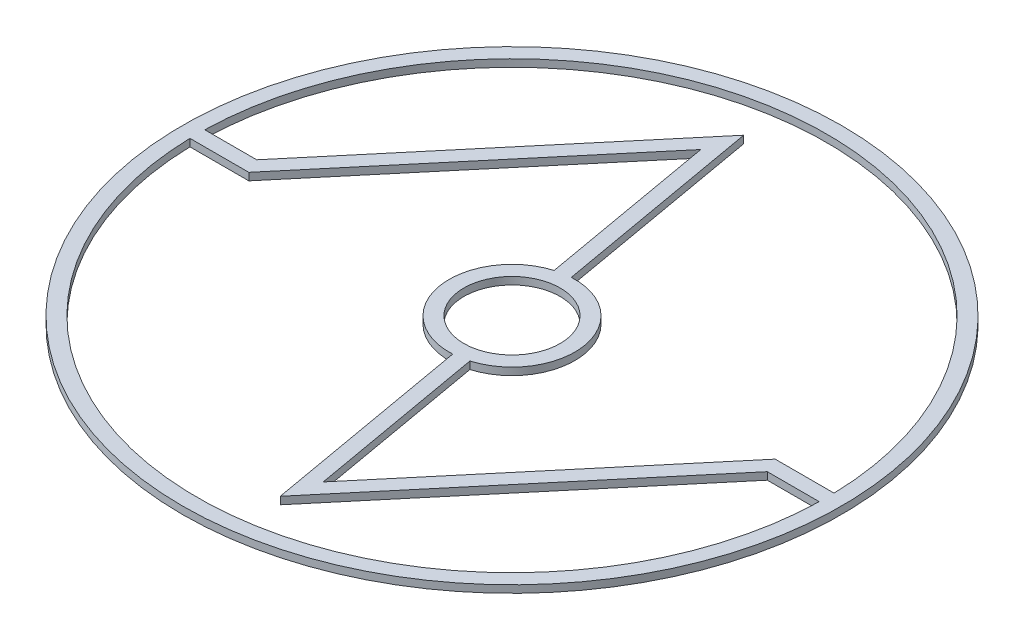
ISO-10303-21;
HEADER;
FILE_DESCRIPTION(('STEP AP214'),'2;1');
FILE_NAME('part.step','',(''),(''),'','','');
FILE_SCHEMA(('AUTOMOTIVE_DESIGN { 1 0 10303 214 1 1 1 1 }'));
ENDSEC;
DATA;
#1=APPLICATION_CONTEXT('core data for automotive mechanical design processes');
#2=APPLICATION_PROTOCOL_DEFINITION('international standard','automotive_design',2000,#1);
#3=PRODUCT_CONTEXT('',#1,'mechanical');
#4=PRODUCT('Part','Part','',(#3));
#5=PRODUCT_RELATED_PRODUCT_CATEGORY('part','',(#4));
#6=PRODUCT_DEFINITION_FORMATION('','',#4);
#7=PRODUCT_DEFINITION_CONTEXT('part definition',#1,'design');
#8=PRODUCT_DEFINITION('design','',#6,#7);
#9=PRODUCT_DEFINITION_SHAPE('','',#8);
#10=(LENGTH_UNIT() NAMED_UNIT(*) SI_UNIT(.MILLI.,.METRE.));
#11=(NAMED_UNIT(*) PLANE_ANGLE_UNIT() SI_UNIT($,.RADIAN.));
#12=(NAMED_UNIT(*) SI_UNIT($,.STERADIAN.) SOLID_ANGLE_UNIT());
#13=UNCERTAINTY_MEASURE_WITH_UNIT(LENGTH_MEASURE(1.E-05),#10,'distance_accuracy_value','');
#14=(GEOMETRIC_REPRESENTATION_CONTEXT(3) GLOBAL_UNCERTAINTY_ASSIGNED_CONTEXT((#13)) GLOBAL_UNIT_ASSIGNED_CONTEXT((#10,
#11,#12)) REPRESENTATION_CONTEXT('',''));
#15=CARTESIAN_POINT('',(0.,0.,0.));
#16=DIRECTION('',(0.,0.,1.));
#17=DIRECTION('',(1.,0.,0.));
#18=AXIS2_PLACEMENT_3D('',#15,#16,#17);
#19=CARTESIAN_POINT('',(0.,1.,0.));
#20=DIRECTION('',(0.,-1.,0.));
#21=DIRECTION('',(0.,0.,-1.));
#22=AXIS2_PLACEMENT_3D('',#19,#20,#21);
#23=CYLINDRICAL_SURFACE('',#22,8.5);
#24=CARTESIAN_POINT('',(0.,0.,0.));
#25=DIRECTION('',(0.,1.,0.));
#26=DIRECTION('',(0.,0.,1.));
#27=AXIS2_PLACEMENT_3D('',#24,#25,#26);
#28=CIRCLE('',#27,8.5);
#29=CARTESIAN_POINT('',(2.45056707312651,0.,8.13908600643268));
#30=VERTEX_POINT('',#29);
#31=CARTESIAN_POINT('',(-0.480951567102091,0.,-8.48638236176653));
#32=VERTEX_POINT('',#31);
#33=EDGE_CURVE('E218',#30,#32,#28,.T.);
#34=ORIENTED_EDGE('',*,*,#33,.T.);
#35=DIRECTION('',(0.,-1.,0.));
#36=VECTOR('',#35,1.);
#37=CARTESIAN_POINT('',(-0.480951567102091,1.,-8.48638236176653));
#38=LINE('',#37,#36);
#39=CARTESIAN_POINT('',(-0.480951567102091,1.,-8.48638236176653));
#40=VERTEX_POINT('',#39);
#41=EDGE_CURVE('E11',#40,#32,#38,.T.);
#42=ORIENTED_EDGE('',*,*,#41,.F.);
#43=CARTESIAN_POINT('',(0.,1.,0.));
#44=DIRECTION('',(0.,1.,0.));
#45=DIRECTION('',(0.,0.,1.));
#46=AXIS2_PLACEMENT_3D('',#43,#44,#45);
#47=CIRCLE('',#46,8.5);
#48=CARTESIAN_POINT('',(2.45056707312651,1.,8.13908600643268));
#49=VERTEX_POINT('',#48);
#50=EDGE_CURVE('E491',#49,#40,#47,.T.);
#51=ORIENTED_EDGE('',*,*,#50,.F.);
#52=DIRECTION('',(0.,-1.,0.));
#53=VECTOR('',#52,1.);
#54=CARTESIAN_POINT('',(2.45056707312651,1.,8.13908600643268));
#55=LINE('',#54,#53);
#56=EDGE_CURVE('E57',#49,#30,#55,.T.);
#57=ORIENTED_EDGE('',*,*,#56,.T.);
#58=EDGE_LOOP('',(#34,#42,#51,#57));
#59=FACE_BOUND('',#58,.T.);
#60=ADVANCED_FACE('F38',(#59),#23,.T.);
#61=CARTESIAN_POINT('',(0.984807753012209,1.,-0.173648177666927));
#62=DIRECTION('',(0.984807753012209,0.,-0.173648177666927));
#63=DIRECTION('',(-0.173648177666927,0.,-0.984807753012209));
#64=AXIS2_PLACEMENT_3D('',#61,#62,#63);
#65=PLANE('',#64);
#66=DIRECTION('',(0.173648177666927,0.,0.984807753012209));
#67=VECTOR('',#66,1.);
#68=CARTESIAN_POINT('',(0.984807753012209,0.,-0.173648177666927));
#69=LINE('',#68,#67);
#70=CARTESIAN_POINT('',(-5.46592563419329,0.,-36.7575751597272));
#71=VERTEX_POINT('',#70);
#72=EDGE_CURVE('E220',#71,#32,#69,.T.);
#73=ORIENTED_EDGE('',*,*,#72,.F.);
#74=DIRECTION('',(0.,-1.,0.));
#75=VECTOR('',#74,1.);
#76=CARTESIAN_POINT('',(-5.46592563419329,1.,-36.7575751597272));
#77=LINE('',#76,#75);
#78=CARTESIAN_POINT('',(-5.46592563419329,1.,-36.7575751597272));
#79=VERTEX_POINT('',#78);
#80=EDGE_CURVE('E48',#79,#71,#77,.T.);
#81=ORIENTED_EDGE('',*,*,#80,.F.);
#82=DIRECTION('',(0.173648177666927,0.,0.984807753012209));
#83=VECTOR('',#82,1.);
#84=CARTESIAN_POINT('',(0.984807753012209,1.,-0.173648177666927));
#85=LINE('',#84,#83);
#86=EDGE_CURVE('E493',#79,#40,#85,.T.);
#87=ORIENTED_EDGE('',*,*,#86,.T.);
#88=ORIENTED_EDGE('',*,*,#41,.T.);
#89=EDGE_LOOP('',(#73,#81,#87,#88));
#90=FACE_BOUND('',#89,.T.);
#91=ADVANCED_FACE('F312',(#90),#65,.T.);
#92=CARTESIAN_POINT('',(-21.3071093295311,1.,-17.8787875798634));
#93=DIRECTION('',(-0.766044443118979,0.,-0.642787609686538));
#94=DIRECTION('',(-0.642787609686538,0.,0.766044443118979));
#95=AXIS2_PLACEMENT_3D('',#92,#93,#94);
#96=PLANE('',#95);
#97=DIRECTION('',(0.642787609686538,0.,-0.766044443118979));
#98=VECTOR('',#97,1.);
#99=CARTESIAN_POINT('',(-21.3071093295311,0.,-17.8787875798634));
#100=LINE('',#99,#98);
#101=CARTESIAN_POINT('',(-35.4700937625141,0.,-1.));
#102=VERTEX_POINT('',#101);
#103=EDGE_CURVE('E223',#102,#71,#100,.T.);
#104=ORIENTED_EDGE('',*,*,#103,.F.);
#105=DIRECTION('',(0.,-1.,0.));
#106=VECTOR('',#105,1.);
#107=CARTESIAN_POINT('',(-35.4700937625141,1.,-1.));
#108=LINE('',#107,#106);
#109=CARTESIAN_POINT('',(-35.4700937625141,1.,-1.));
#110=VERTEX_POINT('',#109);
#111=EDGE_CURVE('E244',#110,#102,#108,.T.);
#112=ORIENTED_EDGE('',*,*,#111,.F.);
#113=DIRECTION('',(0.642787609686538,0.,-0.766044443118979));
#114=VECTOR('',#113,1.);
#115=CARTESIAN_POINT('',(-21.3071093295311,1.,-17.8787875798634));
#116=LINE('',#115,#114);
#117=EDGE_CURVE('E496',#110,#79,#116,.T.);
#118=ORIENTED_EDGE('',*,*,#117,.T.);
#119=ORIENTED_EDGE('',*,*,#80,.T.);
#120=EDGE_LOOP('',(#104,#112,#118,#119));
#121=FACE_BOUND('',#120,.T.);
#122=ADVANCED_FACE('F317',(#121),#96,.T.);
#123=CARTESIAN_POINT('',(0.,1.,-1.));
#124=DIRECTION('',(0.,0.,-1.));
#125=DIRECTION('',(-1.,0.,0.));
#126=AXIS2_PLACEMENT_3D('',#123,#124,#125);
#127=PLANE('',#126);
#128=DIRECTION('',(1.,0.,0.));
#129=VECTOR('',#128,1.);
#130=CARTESIAN_POINT('',(0.,0.,-1.));
#131=LINE('',#130,#129);
#132=CARTESIAN_POINT('',(-42.4882336653337,0.,-1.));
#133=VERTEX_POINT('',#132);
#134=EDGE_CURVE('E226',#133,#102,#131,.T.);
#135=ORIENTED_EDGE('',*,*,#134,.F.);
#136=DIRECTION('',(0.,-1.,0.));
#137=VECTOR('',#136,1.);
#138=CARTESIAN_POINT('',(-42.4882336653337,1.,-1.));
#139=LINE('',#138,#137);
#140=CARTESIAN_POINT('',(-42.4882336653337,1.,-1.));
#141=VERTEX_POINT('',#140);
#142=EDGE_CURVE('E242',#141,#133,#139,.T.);
#143=ORIENTED_EDGE('',*,*,#142,.F.);
#144=DIRECTION('',(1.,0.,0.));
#145=VECTOR('',#144,1.);
#146=CARTESIAN_POINT('',(0.,1.,-1.));
#147=LINE('',#146,#145);
#148=EDGE_CURVE('E498',#141,#110,#147,.T.);
#149=ORIENTED_EDGE('',*,*,#148,.T.);
#150=ORIENTED_EDGE('',*,*,#111,.T.);
#151=EDGE_LOOP('',(#135,#143,#149,#150));
#152=FACE_BOUND('',#151,.T.);
#153=ADVANCED_FACE('F338',(#152),#127,.T.);
#154=CARTESIAN_POINT('',(0.,1.,0.));
#155=DIRECTION('',(0.,-1.,0.));
#156=DIRECTION('',(0.,0.,-1.));
#157=AXIS2_PLACEMENT_3D('',#154,#155,#156);
#158=CYLINDRICAL_SURFACE('',#157,42.5);
#159=CARTESIAN_POINT('',(0.,0.,0.));
#160=DIRECTION('',(0.,1.,0.));
#161=DIRECTION('',(0.,0.,1.));
#162=AXIS2_PLACEMENT_3D('',#159,#160,#161);
#163=CIRCLE('',#162,42.5);
#164=CARTESIAN_POINT('',(42.4882336653337,0.,-1.));
#165=VERTEX_POINT('',#164);
#166=EDGE_CURVE('E212',#165,#133,#163,.T.);
#167=ORIENTED_EDGE('',*,*,#166,.F.);
#168=DIRECTION('',(0.,-1.,0.));
#169=VECTOR('',#168,1.);
#170=CARTESIAN_POINT('',(42.4882336653337,1.,-1.));
#171=LINE('',#170,#169);
#172=CARTESIAN_POINT('',(42.4882336653337,1.,-1.));
#173=VERTEX_POINT('',#172);
#174=EDGE_CURVE('E167',#173,#165,#171,.T.);
#175=ORIENTED_EDGE('',*,*,#174,.F.);
#176=CARTESIAN_POINT('',(0.,1.,0.));
#177=DIRECTION('',(0.,1.,0.));
#178=DIRECTION('',(0.,0.,1.));
#179=AXIS2_PLACEMENT_3D('',#176,#177,#178);
#180=CIRCLE('',#179,42.5);
#181=EDGE_CURVE('E178',#173,#141,#180,.T.);
#182=ORIENTED_EDGE('',*,*,#181,.T.);
#183=ORIENTED_EDGE('',*,*,#142,.T.);
#184=EDGE_LOOP('',(#167,#175,#182,#183));
#185=FACE_BOUND('',#184,.T.);
#186=ADVANCED_FACE('F332',(#185),#158,.F.);
#187=CARTESIAN_POINT('',(0.,1.,-1.));
#188=DIRECTION('',(0.,0.,-1.));
#189=DIRECTION('',(-1.,0.,0.));
#190=AXIS2_PLACEMENT_3D('',#187,#188,#189);
#191=PLANE('',#190);
#192=DIRECTION('',(1.,0.,0.));
#193=VECTOR('',#192,1.);
#194=CARTESIAN_POINT('',(0.,0.,-1.));
#195=LINE('',#194,#193);
#196=CARTESIAN_POINT('',(34.5374784462041,0.,-1.));
#197=VERTEX_POINT('',#196);
#198=EDGE_CURVE('E163',#197,#165,#195,.T.);
#199=ORIENTED_EDGE('',*,*,#198,.F.);
#200=DIRECTION('',(0.,-1.,0.));
#201=VECTOR('',#200,1.);
#202=CARTESIAN_POINT('',(34.5374784462041,1.,-1.));
#203=LINE('',#202,#201);
#204=CARTESIAN_POINT('',(34.5374784462041,1.,-1.));
#205=VERTEX_POINT('',#204);
#206=EDGE_CURVE('E158',#205,#197,#203,.T.);
#207=ORIENTED_EDGE('',*,*,#206,.F.);
#208=DIRECTION('',(1.,0.,0.));
#209=VECTOR('',#208,1.);
#210=CARTESIAN_POINT('',(0.,1.,-1.));
#211=LINE('',#210,#209);
#212=EDGE_CURVE('E161',#205,#173,#211,.T.);
#213=ORIENTED_EDGE('',*,*,#212,.T.);
#214=ORIENTED_EDGE('',*,*,#174,.T.);
#215=EDGE_LOOP('',(#199,#207,#213,#214));
#216=FACE_BOUND('',#215,.T.);
#217=ADVANCED_FACE('F160',(#216),#191,.T.);
#218=CARTESIAN_POINT('',(19.7750204432931,1.,16.5932123604904));
#219=DIRECTION('',(-0.766044443118979,0.,-0.642787609686538));
#220=DIRECTION('',(-0.642787609686538,0.,0.766044443118979));
#221=AXIS2_PLACEMENT_3D('',#218,#219,#220);
#222=PLANE('',#221);
#223=DIRECTION('',(0.642787609686538,0.,-0.766044443118979));
#224=VECTOR('',#223,1.);
#225=CARTESIAN_POINT('',(19.7750204432931,0.,16.5932123604904));
#226=LINE('',#225,#224);
#227=CARTESIAN_POINT('',(6.69076170273651,0.,32.186424720981));
#228=VERTEX_POINT('',#227);
#229=EDGE_CURVE('E230',#228,#197,#226,.T.);
#230=ORIENTED_EDGE('',*,*,#229,.F.);
#231=DIRECTION('',(0.,-1.,0.));
#232=VECTOR('',#231,1.);
#233=CARTESIAN_POINT('',(6.69076170273651,1.,32.186424720981));
#234=LINE('',#233,#232);
#235=CARTESIAN_POINT('',(6.69076170273651,1.,32.186424720981));
#236=VERTEX_POINT('',#235);
#237=EDGE_CURVE('E106',#236,#228,#234,.T.);
#238=ORIENTED_EDGE('',*,*,#237,.F.);
#239=DIRECTION('',(0.642787609686538,0.,-0.766044443118979));
#240=VECTOR('',#239,1.);
#241=CARTESIAN_POINT('',(19.7750204432931,1.,16.5932123604904));
#242=LINE('',#241,#240);
#243=EDGE_CURVE('E175',#236,#205,#242,.T.);
#244=ORIENTED_EDGE('',*,*,#243,.T.);
#245=ORIENTED_EDGE('',*,*,#206,.T.);
#246=EDGE_LOOP('',(#230,#238,#244,#245));
#247=FACE_BOUND('',#246,.T.);
#248=ADVANCED_FACE('F180',(#247),#222,.T.);
#249=CARTESIAN_POINT('',(-0.984807753012208,1.,0.173648177666927));
#250=DIRECTION('',(-0.984807753012209,0.,0.173648177666927));
#251=DIRECTION('',(0.173648177666927,0.,0.984807753012209));
#252=AXIS2_PLACEMENT_3D('',#249,#250,#251);
#253=PLANE('',#252);
#254=DIRECTION('',(-0.173648177666927,0.,-0.984807753012209));
#255=VECTOR('',#254,1.);
#256=CARTESIAN_POINT('',(-0.984807753012208,0.,0.173648177666927));
#257=LINE('',#256,#255);
#258=CARTESIAN_POINT('',(-2.45056707312651,0.,-8.13908600643268));
#259=VERTEX_POINT('',#258);
#260=CARTESIAN_POINT('',(-6.69076170273651,0.,-32.186424720981));
#261=VERTEX_POINT('',#260);
#262=EDGE_CURVE('E193',#259,#261,#257,.T.);
#263=ORIENTED_EDGE('',*,*,#262,.F.);
#264=DIRECTION('',(0.,-1.,0.));
#265=VECTOR('',#264,1.);
#266=CARTESIAN_POINT('',(-2.45056707312651,1.,-8.13908600643268));
#267=LINE('',#266,#265);
#268=CARTESIAN_POINT('',(-2.45056707312651,1.,-8.13908600643268));
#269=VERTEX_POINT('',#268);
#270=EDGE_CURVE('E42',#269,#259,#267,.T.);
#271=ORIENTED_EDGE('',*,*,#270,.F.);
#272=DIRECTION('',(-0.173648177666927,0.,-0.984807753012209));
#273=VECTOR('',#272,1.);
#274=CARTESIAN_POINT('',(-0.984807753012208,1.,0.173648177666927));
#275=LINE('',#274,#273);
#276=CARTESIAN_POINT('',(-6.69076170273651,1.,-32.186424720981));
#277=VERTEX_POINT('',#276);
#278=EDGE_CURVE('E272',#269,#277,#275,.T.);
#279=ORIENTED_EDGE('',*,*,#278,.T.);
#280=DIRECTION('',(0.,-1.,0.));
#281=VECTOR('',#280,1.);
#282=CARTESIAN_POINT('',(-6.69076170273651,1.,-32.186424720981));
#283=LINE('',#282,#281);
#284=EDGE_CURVE('E189',#277,#261,#283,.T.);
#285=ORIENTED_EDGE('',*,*,#284,.T.);
#286=EDGE_LOOP('',(#263,#271,#279,#285));
#287=FACE_BOUND('',#286,.T.);
#288=ADVANCED_FACE('F271',(#287),#253,.T.);
#289=CARTESIAN_POINT('',(0.,1.,0.));
#290=DIRECTION('',(0.,-1.,0.));
#291=DIRECTION('',(0.,0.,-1.));
#292=AXIS2_PLACEMENT_3D('',#289,#290,#291);
#293=CYLINDRICAL_SURFACE('',#292,8.5);
#294=CARTESIAN_POINT('',(0.,0.,0.));
#295=DIRECTION('',(0.,1.,0.));
#296=DIRECTION('',(0.,0.,1.));
#297=AXIS2_PLACEMENT_3D('',#294,#295,#296);
#298=CIRCLE('',#297,8.5);
#299=CARTESIAN_POINT('',(0.480951567102092,0.,8.48638236176653));
#300=VERTEX_POINT('',#299);
#301=EDGE_CURVE('E196',#259,#300,#298,.T.);
#302=ORIENTED_EDGE('',*,*,#301,.T.);
#303=DIRECTION('',(0.,-1.,0.));
#304=VECTOR('',#303,1.);
#305=CARTESIAN_POINT('',(0.480951567102092,1.,8.48638236176653));
#306=LINE('',#305,#304);
#307=CARTESIAN_POINT('',(0.480951567102092,1.,8.48638236176653));
#308=VERTEX_POINT('',#307);
#309=EDGE_CURVE('E257',#308,#300,#306,.T.);
#310=ORIENTED_EDGE('',*,*,#309,.F.);
#311=CARTESIAN_POINT('',(0.,1.,0.));
#312=DIRECTION('',(0.,1.,0.));
#313=DIRECTION('',(0.,0.,1.));
#314=AXIS2_PLACEMENT_3D('',#311,#312,#313);
#315=CIRCLE('',#314,8.5);
#316=EDGE_CURVE('E265',#269,#308,#315,.T.);
#317=ORIENTED_EDGE('',*,*,#316,.F.);
#318=ORIENTED_EDGE('',*,*,#270,.T.);
#319=EDGE_LOOP('',(#302,#310,#317,#318));
#320=FACE_BOUND('',#319,.T.);
#321=ADVANCED_FACE('F264',(#320),#293,.T.);
#322=CARTESIAN_POINT('',(-0.984807753012208,1.,0.173648177666927));
#323=DIRECTION('',(-0.984807753012209,0.,0.173648177666927));
#324=DIRECTION('',(0.173648177666927,0.,0.984807753012209));
#325=AXIS2_PLACEMENT_3D('',#322,#323,#324);
#326=PLANE('',#325);
#327=DIRECTION('',(-0.173648177666927,0.,-0.984807753012209));
#328=VECTOR('',#327,1.);
#329=CARTESIAN_POINT('',(-0.984807753012208,0.,0.173648177666927));
#330=LINE('',#329,#328);
#331=CARTESIAN_POINT('',(5.46592563419329,0.,36.7575751597272));
#332=VERTEX_POINT('',#331);
#333=EDGE_CURVE('E199',#332,#300,#330,.T.);
#334=ORIENTED_EDGE('',*,*,#333,.F.);
#335=DIRECTION('',(0.,-1.,0.));
#336=VECTOR('',#335,1.);
#337=CARTESIAN_POINT('',(5.46592563419329,1.,36.7575751597272));
#338=LINE('',#337,#336);
#339=CARTESIAN_POINT('',(5.46592563419329,1.,36.7575751597272));
#340=VERTEX_POINT('',#339);
#341=EDGE_CURVE('E256',#340,#332,#338,.T.);
#342=ORIENTED_EDGE('',*,*,#341,.F.);
#343=DIRECTION('',(-0.173648177666927,0.,-0.984807753012209));
#344=VECTOR('',#343,1.);
#345=CARTESIAN_POINT('',(-0.984807753012208,1.,0.173648177666927));
#346=LINE('',#345,#344);
#347=EDGE_CURVE('E480',#340,#308,#346,.T.);
#348=ORIENTED_EDGE('',*,*,#347,.T.);
#349=ORIENTED_EDGE('',*,*,#309,.T.);
#350=EDGE_LOOP('',(#334,#342,#348,#349));
#351=FACE_BOUND('',#350,.T.);
#352=ADVANCED_FACE('F302',(#351),#326,.T.);
#353=CARTESIAN_POINT('',(21.3071093295311,1.,17.8787875798634));
#354=DIRECTION('',(0.766044443118979,0.,0.642787609686538));
#355=DIRECTION('',(0.642787609686538,0.,-0.766044443118979));
#356=AXIS2_PLACEMENT_3D('',#353,#354,#355);
#357=PLANE('',#356);
#358=DIRECTION('',(-0.642787609686538,0.,0.766044443118979));
#359=VECTOR('',#358,1.);
#360=CARTESIAN_POINT('',(21.3071093295311,0.,17.8787875798634));
#361=LINE('',#360,#359);
#362=CARTESIAN_POINT('',(35.4700937625141,0.,1.));
#363=VERTEX_POINT('',#362);
#364=EDGE_CURVE('E202',#363,#332,#361,.T.);
#365=ORIENTED_EDGE('',*,*,#364,.F.);
#366=DIRECTION('',(0.,-1.,0.));
#367=VECTOR('',#366,1.);
#368=CARTESIAN_POINT('',(35.4700937625141,1.,1.));
#369=LINE('',#368,#367);
#370=CARTESIAN_POINT('',(35.4700937625141,1.,1.));
#371=VERTEX_POINT('',#370);
#372=EDGE_CURVE('E254',#371,#363,#369,.T.);
#373=ORIENTED_EDGE('',*,*,#372,.F.);
#374=DIRECTION('',(-0.642787609686538,0.,0.766044443118979));
#375=VECTOR('',#374,1.);
#376=CARTESIAN_POINT('',(21.3071093295311,1.,17.8787875798634));
#377=LINE('',#376,#375);
#378=EDGE_CURVE('E300',#371,#340,#377,.T.);
#379=ORIENTED_EDGE('',*,*,#378,.T.);
#380=ORIENTED_EDGE('',*,*,#341,.T.);
#381=EDGE_LOOP('',(#365,#373,#379,#380));
#382=FACE_BOUND('',#381,.T.);
#383=ADVANCED_FACE('F297',(#382),#357,.T.);
#384=CARTESIAN_POINT('',(0.,1.,1.00000000000001));
#385=DIRECTION('',(0.,0.,1.));
#386=DIRECTION('',(1.,0.,0.));
#387=AXIS2_PLACEMENT_3D('',#384,#385,#386);
#388=PLANE('',#387);
#389=DIRECTION('',(-1.,0.,0.));
#390=VECTOR('',#389,1.);
#391=CARTESIAN_POINT('',(0.,0.,1.00000000000001));
#392=LINE('',#391,#390);
#393=CARTESIAN_POINT('',(42.4882336653337,0.,1.));
#394=VERTEX_POINT('',#393);
#395=EDGE_CURVE('E205',#394,#363,#392,.T.);
#396=ORIENTED_EDGE('',*,*,#395,.F.);
#397=DIRECTION('',(0.,-1.,0.));
#398=VECTOR('',#397,1.);
#399=CARTESIAN_POINT('',(42.4882336653337,1.,1.));
#400=LINE('',#399,#398);
#401=CARTESIAN_POINT('',(42.4882336653337,1.,1.));
#402=VERTEX_POINT('',#401);
#403=EDGE_CURVE('E252',#402,#394,#400,.T.);
#404=ORIENTED_EDGE('',*,*,#403,.F.);
#405=DIRECTION('',(-1.,0.,0.));
#406=VECTOR('',#405,1.);
#407=CARTESIAN_POINT('',(0.,1.,1.00000000000001));
#408=LINE('',#407,#406);
#409=EDGE_CURVE('E486',#402,#371,#408,.T.);
#410=ORIENTED_EDGE('',*,*,#409,.T.);
#411=ORIENTED_EDGE('',*,*,#372,.T.);
#412=EDGE_LOOP('',(#396,#404,#410,#411));
#413=FACE_BOUND('',#412,.T.);
#414=ADVANCED_FACE('F294',(#413),#388,.T.);
#415=CARTESIAN_POINT('',(-42.4882336653337,0.,1.));
#416=VERTEX_POINT('',#415);
#417=EDGE_CURVE('E208',#416,#394,#163,.T.);
#418=ORIENTED_EDGE('',*,*,#417,.F.);
#419=DIRECTION('',(0.,-1.,0.));
#420=VECTOR('',#419,1.);
#421=CARTESIAN_POINT('',(-42.4882336653337,1.,1.));
#422=LINE('',#421,#420);
#423=CARTESIAN_POINT('',(-42.4882336653337,1.,1.));
#424=VERTEX_POINT('',#423);
#425=EDGE_CURVE('E250',#424,#416,#422,.T.);
#426=ORIENTED_EDGE('',*,*,#425,.F.);
#427=EDGE_CURVE('E290',#424,#402,#180,.T.);
#428=ORIENTED_EDGE('',*,*,#427,.T.);
#429=ORIENTED_EDGE('',*,*,#403,.T.);
#430=EDGE_LOOP('',(#418,#426,#428,#429));
#431=FACE_BOUND('',#430,.T.);
#432=ADVANCED_FACE('F288',(#431),#158,.F.);
#433=CARTESIAN_POINT('',(0.,1.,0.999999999999992));
#434=DIRECTION('',(0.,0.,1.));
#435=DIRECTION('',(1.,0.,0.));
#436=AXIS2_PLACEMENT_3D('',#433,#434,#435);
#437=PLANE('',#436);
#438=DIRECTION('',(-1.,0.,0.));
#439=VECTOR('',#438,1.);
#440=CARTESIAN_POINT('',(0.,0.,0.999999999999992));
#441=LINE('',#440,#439);
#442=CARTESIAN_POINT('',(-34.5374784462041,0.,0.999999999999997));
#443=VERTEX_POINT('',#442);
#444=EDGE_CURVE('E211',#443,#416,#441,.T.);
#445=ORIENTED_EDGE('',*,*,#444,.F.);
#446=DIRECTION('',(0.,-1.,0.));
#447=VECTOR('',#446,1.);
#448=CARTESIAN_POINT('',(-34.5374784462041,1.,0.999999999999997));
#449=LINE('',#448,#447);
#450=CARTESIAN_POINT('',(-34.5374784462041,1.,0.999999999999997));
#451=VERTEX_POINT('',#450);
#452=EDGE_CURVE('E248',#451,#443,#449,.T.);
#453=ORIENTED_EDGE('',*,*,#452,.F.);
#454=DIRECTION('',(-1.,0.,0.));
#455=VECTOR('',#454,1.);
#456=CARTESIAN_POINT('',(0.,1.,0.999999999999992));
#457=LINE('',#456,#455);
#458=EDGE_CURVE('E284',#451,#424,#457,.T.);
#459=ORIENTED_EDGE('',*,*,#458,.T.);
#460=ORIENTED_EDGE('',*,*,#425,.T.);
#461=EDGE_LOOP('',(#445,#453,#459,#460));
#462=FACE_BOUND('',#461,.T.);
#463=ADVANCED_FACE('F281',(#462),#437,.T.);
#464=CARTESIAN_POINT('',(0.984807753012209,1.,-0.173648177666927));
#465=DIRECTION('',(0.984807753012209,0.,-0.173648177666927));
#466=DIRECTION('',(-0.173648177666927,0.,-0.984807753012209));
#467=AXIS2_PLACEMENT_3D('',#464,#465,#466);
#468=PLANE('',#467);
#469=DIRECTION('',(0.173648177666927,0.,0.984807753012209));
#470=VECTOR('',#469,1.);
#471=CARTESIAN_POINT('',(0.984807753012209,0.,-0.173648177666927));
#472=LINE('',#471,#470);
#473=EDGE_CURVE('E232',#30,#228,#472,.T.);
#474=ORIENTED_EDGE('',*,*,#473,.F.);
#475=ORIENTED_EDGE('',*,*,#56,.F.);
#476=DIRECTION('',(0.173648177666927,0.,0.984807753012209));
#477=VECTOR('',#476,1.);
#478=CARTESIAN_POINT('',(0.984807753012209,1.,-0.173648177666927));
#479=LINE('',#478,#477);
#480=EDGE_CURVE('E181',#49,#236,#479,.T.);
#481=ORIENTED_EDGE('',*,*,#480,.T.);
#482=ORIENTED_EDGE('',*,*,#237,.T.);
#483=EDGE_LOOP('',(#474,#475,#481,#482));
#484=FACE_BOUND('',#483,.T.);
#485=ADVANCED_FACE('F324',(#484),#468,.T.);
#486=CARTESIAN_POINT('',(-19.7750204432931,1.,-16.5932123604904));
#487=DIRECTION('',(0.766044443118979,0.,0.642787609686538));
#488=DIRECTION('',(0.642787609686538,0.,-0.766044443118979));
#489=AXIS2_PLACEMENT_3D('',#486,#487,#488);
#490=PLANE('',#489);
#491=DIRECTION('',(-0.642787609686538,0.,0.766044443118979));
#492=VECTOR('',#491,1.);
#493=CARTESIAN_POINT('',(-19.7750204432931,0.,-16.5932123604904));
#494=LINE('',#493,#492);
#495=EDGE_CURVE('E215',#261,#443,#494,.T.);
#496=ORIENTED_EDGE('',*,*,#495,.F.);
#497=ORIENTED_EDGE('',*,*,#284,.F.);
#498=DIRECTION('',(-0.642787609686538,0.,0.766044443118979));
#499=VECTOR('',#498,1.);
#500=CARTESIAN_POINT('',(-19.7750204432931,1.,-16.5932123604904));
#501=LINE('',#500,#499);
#502=EDGE_CURVE('E277',#277,#451,#501,.T.);
#503=ORIENTED_EDGE('',*,*,#502,.T.);
#504=ORIENTED_EDGE('',*,*,#452,.T.);
#505=EDGE_LOOP('',(#496,#497,#503,#504));
#506=FACE_BOUND('',#505,.T.);
#507=ADVANCED_FACE('F276',(#506),#490,.T.);
#508=CARTESIAN_POINT('',(0.,1.,0.));
#509=DIRECTION('',(0.,-1.,0.));
#510=DIRECTION('',(0.,0.,-1.));
#511=AXIS2_PLACEMENT_3D('',#508,#509,#510);
#512=CYLINDRICAL_SURFACE('',#511,6.5);
#513=CARTESIAN_POINT('',(0.,1.,0.));
#514=DIRECTION('',(0.,1.,0.));
#515=DIRECTION('',(0.,0.,1.));
#516=AXIS2_PLACEMENT_3D('',#513,#514,#515);
#517=CIRCLE('',#516,6.5);
#518=CARTESIAN_POINT('',(0.,1.,6.5));
#519=VERTEX_POINT('',#518);
#520=EDGE_CURVE('E238',#519,#519,#517,.T.);
#521=ORIENTED_EDGE('',*,*,#520,.T.);
#522=EDGE_LOOP('',(#521));
#523=FACE_BOUND('',#522,.T.);
#524=CARTESIAN_POINT('',(0.,0.,0.));
#525=DIRECTION('',(0.,1.,0.));
#526=DIRECTION('',(0.,0.,1.));
#527=AXIS2_PLACEMENT_3D('',#524,#525,#526);
#528=CIRCLE('',#527,6.5);
#529=CARTESIAN_POINT('',(0.,0.,6.5));
#530=VERTEX_POINT('',#529);
#531=EDGE_CURVE('E190',#530,#530,#528,.T.);
#532=ORIENTED_EDGE('',*,*,#531,.F.);
#533=EDGE_LOOP('',(#532));
#534=FACE_BOUND('',#533,.T.);
#535=ADVANCED_FACE('F40',(#523,#534),#512,.F.);
#536=CARTESIAN_POINT('',(0.,1.,0.));
#537=DIRECTION('',(0.,-1.,0.));
#538=DIRECTION('',(0.,0.,-1.));
#539=AXIS2_PLACEMENT_3D('',#536,#537,#538);
#540=CYLINDRICAL_SURFACE('',#539,44.5);
#541=CARTESIAN_POINT('',(0.,1.,0.));
#542=DIRECTION('',(0.,1.,0.));
#543=DIRECTION('',(0.,0.,1.));
#544=AXIS2_PLACEMENT_3D('',#541,#542,#543);
#545=CIRCLE('',#544,44.5);
#546=CARTESIAN_POINT('',(0.,1.,44.5));
#547=VERTEX_POINT('',#546);
#548=EDGE_CURVE('E183',#547,#547,#545,.T.);
#549=ORIENTED_EDGE('',*,*,#548,.F.);
#550=EDGE_LOOP('',(#549));
#551=FACE_BOUND('',#550,.T.);
#552=CARTESIAN_POINT('',(0.,0.,0.));
#553=DIRECTION('',(0.,1.,0.));
#554=DIRECTION('',(0.,0.,1.));
#555=AXIS2_PLACEMENT_3D('',#552,#553,#554);
#556=CIRCLE('',#555,44.5);
#557=CARTESIAN_POINT('',(0.,0.,44.5));
#558=VERTEX_POINT('',#557);
#559=EDGE_CURVE('E235',#558,#558,#556,.T.);
#560=ORIENTED_EDGE('',*,*,#559,.T.);
#561=EDGE_LOOP('',(#560));
#562=FACE_BOUND('',#561,.T.);
#563=ADVANCED_FACE('F355',(#551,#562),#540,.T.);
#564=CARTESIAN_POINT('',(0.,1.,0.));
#565=DIRECTION('',(0.,1.,0.));
#566=DIRECTION('',(0.,0.,1.));
#567=AXIS2_PLACEMENT_3D('',#564,#565,#566);
#568=PLANE('',#567);
#569=ORIENTED_EDGE('',*,*,#520,.F.);
#570=EDGE_LOOP('',(#569));
#571=FACE_BOUND('',#570,.T.);
#572=ORIENTED_EDGE('',*,*,#278,.F.);
#573=ORIENTED_EDGE('',*,*,#316,.T.);
#574=ORIENTED_EDGE('',*,*,#347,.F.);
#575=ORIENTED_EDGE('',*,*,#378,.F.);
#576=ORIENTED_EDGE('',*,*,#409,.F.);
#577=ORIENTED_EDGE('',*,*,#427,.F.);
#578=ORIENTED_EDGE('',*,*,#458,.F.);
#579=ORIENTED_EDGE('',*,*,#502,.F.);
#580=EDGE_LOOP('',(#572,#573,#574,#575,#576,#577,#578,#579));
#581=FACE_BOUND('',#580,.T.);
#582=ORIENTED_EDGE('',*,*,#50,.T.);
#583=ORIENTED_EDGE('',*,*,#86,.F.);
#584=ORIENTED_EDGE('',*,*,#117,.F.);
#585=ORIENTED_EDGE('',*,*,#148,.F.);
#586=ORIENTED_EDGE('',*,*,#181,.F.);
#587=ORIENTED_EDGE('',*,*,#212,.F.);
#588=ORIENTED_EDGE('',*,*,#243,.F.);
#589=ORIENTED_EDGE('',*,*,#480,.F.);
#590=EDGE_LOOP('',(#582,#583,#584,#585,#586,#587,#588,#589));
#591=FACE_BOUND('',#590,.T.);
#592=ORIENTED_EDGE('',*,*,#548,.T.);
#593=EDGE_LOOP('',(#592));
#594=FACE_BOUND('',#593,.T.);
#595=ADVANCED_FACE('F172',(#571,#581,#591,#594),#568,.T.);
#596=CARTESIAN_POINT('',(0.,0.,0.));
#597=DIRECTION('',(0.,1.,0.));
#598=DIRECTION('',(0.,0.,1.));
#599=AXIS2_PLACEMENT_3D('',#596,#597,#598);
#600=PLANE('',#599);
#601=ORIENTED_EDGE('',*,*,#531,.T.);
#602=EDGE_LOOP('',(#601));
#603=FACE_BOUND('',#602,.T.);
#604=ORIENTED_EDGE('',*,*,#262,.T.);
#605=ORIENTED_EDGE('',*,*,#495,.T.);
#606=ORIENTED_EDGE('',*,*,#444,.T.);
#607=ORIENTED_EDGE('',*,*,#417,.T.);
#608=ORIENTED_EDGE('',*,*,#395,.T.);
#609=ORIENTED_EDGE('',*,*,#364,.T.);
#610=ORIENTED_EDGE('',*,*,#333,.T.);
#611=ORIENTED_EDGE('',*,*,#301,.F.);
#612=EDGE_LOOP('',(#604,#605,#606,#607,#608,#609,#610,#611));
#613=FACE_BOUND('',#612,.T.);
#614=ORIENTED_EDGE('',*,*,#33,.F.);
#615=ORIENTED_EDGE('',*,*,#473,.T.);
#616=ORIENTED_EDGE('',*,*,#229,.T.);
#617=ORIENTED_EDGE('',*,*,#198,.T.);
#618=ORIENTED_EDGE('',*,*,#166,.T.);
#619=ORIENTED_EDGE('',*,*,#134,.T.);
#620=ORIENTED_EDGE('',*,*,#103,.T.);
#621=ORIENTED_EDGE('',*,*,#72,.T.);
#622=EDGE_LOOP('',(#614,#615,#616,#617,#618,#619,#620,#621));
#623=FACE_BOUND('',#622,.T.);
#624=ORIENTED_EDGE('',*,*,#559,.F.);
#625=EDGE_LOOP('',(#624));
#626=FACE_BOUND('',#625,.T.);
#627=ADVANCED_FACE('F268',(#603,#613,#623,#626),#600,.F.);
#628=CLOSED_SHELL('',(#60,#91,#122,#153,#186,#217,#248,#288,#321,#352,#383,#414,#432,#463,#485,
#507,#535,#563,#595,#627));
#629=MANIFOLD_SOLID_BREP('B2',#628);
#630=ADVANCED_BREP_SHAPE_REPRESENTATION('',(#18,#629),#14);
#631=SHAPE_DEFINITION_REPRESENTATION(#9,#630);
ENDSEC;
END-ISO-10303-21;
